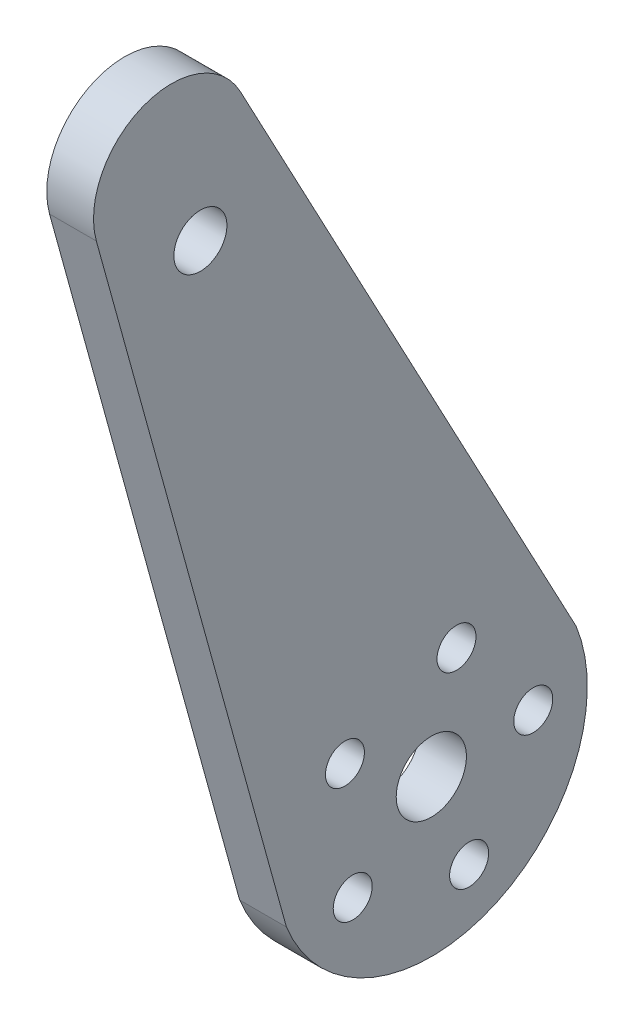
ISO-10303-21;
HEADER;
FILE_DESCRIPTION(('STEP AP214'),'2;1');
FILE_NAME('part.step','',(''),(''),'','','');
FILE_SCHEMA(('AUTOMOTIVE_DESIGN { 1 0 10303 214 1 1 1 1 }'));
ENDSEC;
DATA;
#1=APPLICATION_CONTEXT('core data for automotive mechanical design processes');
#2=APPLICATION_PROTOCOL_DEFINITION('international standard','automotive_design',2000,#1);
#3=PRODUCT_CONTEXT('',#1,'mechanical');
#4=PRODUCT('Part','Part','',(#3));
#5=PRODUCT_RELATED_PRODUCT_CATEGORY('part','',(#4));
#6=PRODUCT_DEFINITION_FORMATION('','',#4);
#7=PRODUCT_DEFINITION_CONTEXT('part definition',#1,'design');
#8=PRODUCT_DEFINITION('design','',#6,#7);
#9=PRODUCT_DEFINITION_SHAPE('','',#8);
#10=(LENGTH_UNIT() NAMED_UNIT(*) SI_UNIT(.MILLI.,.METRE.));
#11=(NAMED_UNIT(*) PLANE_ANGLE_UNIT() SI_UNIT($,.RADIAN.));
#12=(NAMED_UNIT(*) SI_UNIT($,.STERADIAN.) SOLID_ANGLE_UNIT());
#13=UNCERTAINTY_MEASURE_WITH_UNIT(LENGTH_MEASURE(1.E-05),#10,'distance_accuracy_value','');
#14=(GEOMETRIC_REPRESENTATION_CONTEXT(3) GLOBAL_UNCERTAINTY_ASSIGNED_CONTEXT((#13)) GLOBAL_UNIT_ASSIGNED_CONTEXT((#10,
#11,#12)) REPRESENTATION_CONTEXT('',''));
#15=CARTESIAN_POINT('',(0.,0.,0.));
#16=DIRECTION('',(0.,0.,1.));
#17=DIRECTION('',(1.,0.,0.));
#18=AXIS2_PLACEMENT_3D('',#15,#16,#17);
#19=CARTESIAN_POINT('',(-9.99999999999864,57.2046296254785,136.654517161316));
#20=DIRECTION('',(-1.,0.,0.));
#21=DIRECTION('',(0.,0.,1.));
#22=AXIS2_PLACEMENT_3D('',#19,#20,#21);
#23=PLANE('',#22);
#24=CARTESIAN_POINT('',(-10.,15.4,120.));
#25=DIRECTION('',(-1.,0.,0.));
#26=DIRECTION('',(0.,0.,1.));
#27=AXIS2_PLACEMENT_3D('',#24,#25,#26);
#28=CIRCLE('',#27,2.25);
#29=CARTESIAN_POINT('',(-10.,15.4,122.25));
#30=VERTEX_POINT('',#29);
#31=EDGE_CURVE('E143',#30,#30,#28,.T.);
#32=ORIENTED_EDGE('',*,*,#31,.F.);
#33=EDGE_LOOP('',(#32));
#34=FACE_BOUND('',#33,.T.);
#35=CARTESIAN_POINT('',(-10.,52.5596707782031,134.804015254503));
#36=DIRECTION('',(-1.,0.,0.));
#37=DIRECTION('',(0.,0.,1.));
#38=AXIS2_PLACEMENT_3D('',#35,#36,#37);
#39=CIRCLE('',#38,1.7);
#40=CARTESIAN_POINT('',(-10.,52.5596707782031,136.504015254503));
#41=VERTEX_POINT('',#40);
#42=EDGE_CURVE('E133',#41,#41,#39,.T.);
#43=ORIENTED_EDGE('',*,*,#42,.F.);
#44=EDGE_LOOP('',(#43));
#45=FACE_BOUND('',#44,.T.);
#46=CARTESIAN_POINT('',(-9.99999999999887,15.8251744841329,113.463814058792));
#47=DIRECTION('',(-1.,0.,0.));
#48=DIRECTION('',(0.,0.,1.));
#49=AXIS2_PLACEMENT_3D('',#46,#47,#48);
#50=CIRCLE('',#49,1.24999999999995);
#51=CARTESIAN_POINT('',(-9.99999999999886,15.8251744841329,114.713814058792));
#52=VERTEX_POINT('',#51);
#53=EDGE_CURVE('E159',#52,#52,#50,.T.);
#54=ORIENTED_EDGE('',*,*,#53,.F.);
#55=EDGE_LOOP('',(#54));
#56=FACE_BOUND('',#55,.T.);
#57=CARTESIAN_POINT('',(-9.99999999999875,11.2141529142785,125.037974213407));
#58=DIRECTION('',(-1.,0.,0.));
#59=DIRECTION('',(0.,0.,1.));
#60=AXIS2_PLACEMENT_3D('',#57,#58,#59);
#61=CIRCLE('',#60,1.25000000000004);
#62=CARTESIAN_POINT('',(-9.99999999999874,11.2141529142785,126.287974213407));
#63=VERTEX_POINT('',#62);
#64=EDGE_CURVE('E175',#63,#63,#61,.T.);
#65=ORIENTED_EDGE('',*,*,#64,.F.);
#66=EDGE_LOOP('',(#65));
#67=FACE_BOUND('',#66,.T.);
#68=CARTESIAN_POINT('',(-9.99999999999864,57.2046296254785,136.654517161316));
#69=DIRECTION('',(-1.,0.,0.));
#70=DIRECTION('',(0.,0.,1.));
#71=AXIS2_PLACEMENT_3D('',#68,#69,#70);
#72=CIRCLE('',#71,5.00000000000002);
#73=CARTESIAN_POINT('',(-9.99999999999859,55.8751790081828,141.474533868433));
#74=VERTEX_POINT('',#73);
#75=CARTESIAN_POINT('',(-9.99999999999868,59.5538184181805,132.240753232821));
#76=VERTEX_POINT('',#75);
#77=EDGE_CURVE('E80',#74,#76,#72,.T.);
#78=ORIENTED_EDGE('',*,*,#77,.T.);
#79=DIRECTION('',(0.,0.882752785708339,0.469837758512625));
#80=VECTOR('',#79,1.);
#81=CARTESIAN_POINT('',(-10.0000000020829,-392844.673959146,-208987.7356182));
#82=LINE('',#81,#80);
#83=CARTESIAN_POINT('',(-9.9999999999989,19.1010038137222,110.710082305488));
#84=VERTEX_POINT('',#83);
#85=EDGE_CURVE('E88',#84,#76,#82,.T.);
#86=ORIENTED_EDGE('',*,*,#85,.F.);
#87=CARTESIAN_POINT('',(-9.9999999999988,15.4,120.));
#88=DIRECTION('',(-1.,0.,0.));
#89=DIRECTION('',(0.,0.,1.));
#90=AXIS2_PLACEMENT_3D('',#87,#88,#89);
#91=CIRCLE('',#90,9.99999999999999);
#92=CARTESIAN_POINT('',(-9.99999999999871,11.6989961864533,129.289917694649));
#93=VERTEX_POINT('',#92);
#94=EDGE_CURVE('E94',#84,#93,#91,.T.);
#95=ORIENTED_EDGE('',*,*,#94,.T.);
#96=DIRECTION('',(0.,-0.964003341403419,-0.265890123477808));
#97=VECTOR('',#96,1.);
#98=CARTESIAN_POINT('',(-10.0000000010246,-373154.184489817,-102796.82929404));
#99=LINE('',#98,#97);
#100=EDGE_CURVE('E97',#74,#93,#99,.T.);
#101=ORIENTED_EDGE('',*,*,#100,.F.);
#102=EDGE_LOOP('',(#78,#86,#95,#101));
#103=FACE_BOUND('',#102,.T.);
#104=CARTESIAN_POINT('',(-9.99999999999883,9.31510391006918,117.575842502075));
#105=DIRECTION('',(-1.,0.,0.));
#106=DIRECTION('',(0.,0.,1.));
#107=AXIS2_PLACEMENT_3D('',#104,#105,#106);
#108=CIRCLE('',#107,1.24999999999995);
#109=CARTESIAN_POINT('',(-9.99999999999882,9.31510391006918,118.825842502075));
#110=VERTEX_POINT('',#109);
#111=EDGE_CURVE('E113',#110,#110,#108,.T.);
#112=ORIENTED_EDGE('',*,*,#111,.F.);
#113=EDGE_LOOP('',(#112));
#114=FACE_BOUND('',#113,.T.);
#115=CARTESIAN_POINT('',(-9.99999999999875,18.8979003192452,125.537796796256));
#116=DIRECTION('',(-1.,0.,0.));
#117=DIRECTION('',(0.,0.,1.));
#118=AXIS2_PLACEMENT_3D('',#115,#116,#117);
#119=CIRCLE('',#118,1.24999999999992);
#120=CARTESIAN_POINT('',(-9.99999999999874,18.8979003192452,126.787796796256));
#121=VERTEX_POINT('',#120);
#122=EDGE_CURVE('E167',#121,#121,#119,.T.);
#123=ORIENTED_EDGE('',*,*,#122,.F.);
#124=EDGE_LOOP('',(#123));
#125=FACE_BOUND('',#124,.T.);
#126=CARTESIAN_POINT('',(-9.99999999999882,21.7476683722741,118.384572429469));
#127=DIRECTION('',(-1.,0.,0.));
#128=DIRECTION('',(0.,0.,1.));
#129=AXIS2_PLACEMENT_3D('',#126,#127,#128);
#130=CIRCLE('',#129,1.24999999999994);
#131=CARTESIAN_POINT('',(-9.99999999999881,21.7476683722741,119.634572429469));
#132=VERTEX_POINT('',#131);
#133=EDGE_CURVE('E151',#132,#132,#130,.T.);
#134=ORIENTED_EDGE('',*,*,#133,.F.);
#135=EDGE_LOOP('',(#134));
#136=FACE_BOUND('',#135,.T.);
#137=ADVANCED_FACE('F37',(#34,#45,#56,#67,#103,#114,#125,#136),#23,.T.);
#138=CARTESIAN_POINT('',(-6.99999999999864,57.2046296254785,136.654517161316));
#139=DIRECTION('',(-1.,0.,0.));
#140=DIRECTION('',(0.,0.,1.));
#141=AXIS2_PLACEMENT_3D('',#138,#139,#140);
#142=PLANE('',#141);
#143=CARTESIAN_POINT('',(-6.9999999999986,15.4,120.));
#144=DIRECTION('',(-1.,0.,0.));
#145=DIRECTION('',(0.,0.,1.));
#146=AXIS2_PLACEMENT_3D('',#143,#144,#145);
#147=CIRCLE('',#146,2.25);
#148=CARTESIAN_POINT('',(-6.9999999999986,15.4,122.25));
#149=VERTEX_POINT('',#148);
#150=EDGE_CURVE('E138',#149,#149,#147,.T.);
#151=ORIENTED_EDGE('',*,*,#150,.T.);
#152=EDGE_LOOP('',(#151));
#153=FACE_BOUND('',#152,.T.);
#154=CARTESIAN_POINT('',(-6.9999999999986,52.5596707782031,134.804015254503));
#155=DIRECTION('',(-1.,0.,0.));
#156=DIRECTION('',(0.,0.,1.));
#157=AXIS2_PLACEMENT_3D('',#154,#155,#156);
#158=CIRCLE('',#157,1.7);
#159=CARTESIAN_POINT('',(-6.9999999999986,52.5596707782031,136.504015254503));
#160=VERTEX_POINT('',#159);
#161=EDGE_CURVE('E128',#160,#160,#158,.T.);
#162=ORIENTED_EDGE('',*,*,#161,.T.);
#163=EDGE_LOOP('',(#162));
#164=FACE_BOUND('',#163,.T.);
#165=CARTESIAN_POINT('',(-6.99999999999864,57.2046296254785,136.654517161316));
#166=DIRECTION('',(-1.,0.,0.));
#167=DIRECTION('',(0.,0.,1.));
#168=AXIS2_PLACEMENT_3D('',#165,#166,#167);
#169=CIRCLE('',#168,5.00000000000002);
#170=CARTESIAN_POINT('',(-6.99999999999859,55.8751790081828,141.474533868433));
#171=VERTEX_POINT('',#170);
#172=CARTESIAN_POINT('',(-6.99999999999868,59.5538184181805,132.240753232821));
#173=VERTEX_POINT('',#172);
#174=EDGE_CURVE('E110',#171,#173,#169,.T.);
#175=ORIENTED_EDGE('',*,*,#174,.F.);
#176=DIRECTION('',(0.,-0.964003341403419,-0.265890123477808));
#177=VECTOR('',#176,1.);
#178=CARTESIAN_POINT('',(-7.00000000102455,-373154.184489817,-102796.82929404));
#179=LINE('',#178,#177);
#180=CARTESIAN_POINT('',(-6.99999999999871,11.6989961864533,129.289917694649));
#181=VERTEX_POINT('',#180);
#182=EDGE_CURVE('E104',#171,#181,#179,.T.);
#183=ORIENTED_EDGE('',*,*,#182,.T.);
#184=CARTESIAN_POINT('',(-6.9999999999988,15.4,120.));
#185=DIRECTION('',(-1.,0.,0.));
#186=DIRECTION('',(0.,0.,1.));
#187=AXIS2_PLACEMENT_3D('',#184,#185,#186);
#188=CIRCLE('',#187,9.99999999999999);
#189=CARTESIAN_POINT('',(-6.9999999999989,19.1010038137222,110.710082305488));
#190=VERTEX_POINT('',#189);
#191=EDGE_CURVE('E116',#190,#181,#188,.T.);
#192=ORIENTED_EDGE('',*,*,#191,.F.);
#193=DIRECTION('',(0.,0.882752785708339,0.469837758512625));
#194=VECTOR('',#193,1.);
#195=CARTESIAN_POINT('',(-7.00000000208293,-392844.673959146,-208987.7356182));
#196=LINE('',#195,#194);
#197=EDGE_CURVE('E90',#190,#173,#196,.T.);
#198=ORIENTED_EDGE('',*,*,#197,.T.);
#199=EDGE_LOOP('',(#175,#183,#192,#198));
#200=FACE_BOUND('',#199,.T.);
#201=CARTESIAN_POINT('',(-6.99999999999883,9.31510391006918,117.575842502075));
#202=DIRECTION('',(-1.,0.,0.));
#203=DIRECTION('',(0.,0.,1.));
#204=AXIS2_PLACEMENT_3D('',#201,#202,#203);
#205=CIRCLE('',#204,1.24999999999995);
#206=CARTESIAN_POINT('',(-6.99999999999882,9.31510391006918,118.825842502075));
#207=VERTEX_POINT('',#206);
#208=EDGE_CURVE('E179',#207,#207,#205,.T.);
#209=ORIENTED_EDGE('',*,*,#208,.T.);
#210=EDGE_LOOP('',(#209));
#211=FACE_BOUND('',#210,.T.);
#212=CARTESIAN_POINT('',(-6.99999999999875,11.2141529142785,125.037974213407));
#213=DIRECTION('',(-1.,0.,0.));
#214=DIRECTION('',(0.,0.,1.));
#215=AXIS2_PLACEMENT_3D('',#212,#213,#214);
#216=CIRCLE('',#215,1.25000000000004);
#217=CARTESIAN_POINT('',(-6.99999999999874,11.2141529142785,126.287974213407));
#218=VERTEX_POINT('',#217);
#219=EDGE_CURVE('E171',#218,#218,#216,.T.);
#220=ORIENTED_EDGE('',*,*,#219,.T.);
#221=EDGE_LOOP('',(#220));
#222=FACE_BOUND('',#221,.T.);
#223=CARTESIAN_POINT('',(-6.99999999999875,18.8979003192452,125.537796796256));
#224=DIRECTION('',(-1.,0.,0.));
#225=DIRECTION('',(0.,0.,1.));
#226=AXIS2_PLACEMENT_3D('',#223,#224,#225);
#227=CIRCLE('',#226,1.24999999999992);
#228=CARTESIAN_POINT('',(-6.99999999999874,18.8979003192452,126.787796796256));
#229=VERTEX_POINT('',#228);
#230=EDGE_CURVE('E163',#229,#229,#227,.T.);
#231=ORIENTED_EDGE('',*,*,#230,.T.);
#232=EDGE_LOOP('',(#231));
#233=FACE_BOUND('',#232,.T.);
#234=CARTESIAN_POINT('',(-6.99999999999887,15.8251744841329,113.463814058792));
#235=DIRECTION('',(-1.,0.,0.));
#236=DIRECTION('',(0.,0.,1.));
#237=AXIS2_PLACEMENT_3D('',#234,#235,#236);
#238=CIRCLE('',#237,1.24999999999995);
#239=CARTESIAN_POINT('',(-6.99999999999886,15.8251744841329,114.713814058792));
#240=VERTEX_POINT('',#239);
#241=EDGE_CURVE('E155',#240,#240,#238,.T.);
#242=ORIENTED_EDGE('',*,*,#241,.T.);
#243=EDGE_LOOP('',(#242));
#244=FACE_BOUND('',#243,.T.);
#245=CARTESIAN_POINT('',(-6.99999999999882,21.7476683722741,118.384572429469));
#246=DIRECTION('',(-1.,0.,0.));
#247=DIRECTION('',(0.,0.,1.));
#248=AXIS2_PLACEMENT_3D('',#245,#246,#247);
#249=CIRCLE('',#248,1.24999999999994);
#250=CARTESIAN_POINT('',(-6.99999999999881,21.7476683722741,119.634572429469));
#251=VERTEX_POINT('',#250);
#252=EDGE_CURVE('E132',#251,#251,#249,.T.);
#253=ORIENTED_EDGE('',*,*,#252,.T.);
#254=EDGE_LOOP('',(#253));
#255=FACE_BOUND('',#254,.T.);
#256=ADVANCED_FACE('F190',(#153,#164,#200,#211,#222,#233,#244,#255),#142,.F.);
#257=CARTESIAN_POINT('',(-9.99999999999864,57.2046296254785,136.654517161316));
#258=DIRECTION('',(1.,0.,0.));
#259=DIRECTION('',(0.,0.,-1.));
#260=AXIS2_PLACEMENT_3D('',#257,#258,#259);
#261=CYLINDRICAL_SURFACE('',#260,5.00000000000002);
#262=ORIENTED_EDGE('',*,*,#174,.T.);
#263=DIRECTION('',(1.,0.,0.));
#264=VECTOR('',#263,1.);
#265=CARTESIAN_POINT('',(-9.99999999999868,59.5538184181805,132.240753232821));
#266=LINE('',#265,#264);
#267=EDGE_CURVE('E11',#76,#173,#266,.T.);
#268=ORIENTED_EDGE('',*,*,#267,.F.);
#269=ORIENTED_EDGE('',*,*,#77,.F.);
#270=DIRECTION('',(1.,0.,0.));
#271=VECTOR('',#270,1.);
#272=CARTESIAN_POINT('',(-9.99999999999859,55.8751790081828,141.474533868433));
#273=LINE('',#272,#271);
#274=EDGE_CURVE('E55',#74,#171,#273,.T.);
#275=ORIENTED_EDGE('',*,*,#274,.T.);
#276=EDGE_LOOP('',(#262,#268,#269,#275));
#277=FACE_BOUND('',#276,.T.);
#278=ADVANCED_FACE('F39',(#277),#261,.T.);
#279=CARTESIAN_POINT('',(-10.0000000020829,-392844.673959146,-208987.7356182));
#280=DIRECTION('',(0.,0.469837758512624,-0.882752785708339));
#281=DIRECTION('',(0.,0.882752785708339,0.469837758512624));
#282=AXIS2_PLACEMENT_3D('',#279,#280,#281);
#283=PLANE('',#282);
#284=ORIENTED_EDGE('',*,*,#197,.F.);
#285=DIRECTION('',(1.,0.,0.));
#286=VECTOR('',#285,1.);
#287=CARTESIAN_POINT('',(-9.9999999999989,19.1010038137222,110.710082305488));
#288=LINE('',#287,#286);
#289=EDGE_CURVE('E47',#84,#190,#288,.T.);
#290=ORIENTED_EDGE('',*,*,#289,.F.);
#291=ORIENTED_EDGE('',*,*,#85,.T.);
#292=ORIENTED_EDGE('',*,*,#267,.T.);
#293=EDGE_LOOP('',(#284,#290,#291,#292));
#294=FACE_BOUND('',#293,.T.);
#295=ADVANCED_FACE('F87',(#294),#283,.T.);
#296=CARTESIAN_POINT('',(-9.9999999999988,15.4,120.));
#297=DIRECTION('',(1.,0.,0.));
#298=DIRECTION('',(0.,0.,-1.));
#299=AXIS2_PLACEMENT_3D('',#296,#297,#298);
#300=CYLINDRICAL_SURFACE('',#299,9.99999999999999);
#301=ORIENTED_EDGE('',*,*,#191,.T.);
#302=DIRECTION('',(1.,0.,0.));
#303=VECTOR('',#302,1.);
#304=CARTESIAN_POINT('',(-9.99999999999871,11.6989961864533,129.289917694649));
#305=LINE('',#304,#303);
#306=EDGE_CURVE('E69',#93,#181,#305,.T.);
#307=ORIENTED_EDGE('',*,*,#306,.F.);
#308=ORIENTED_EDGE('',*,*,#94,.F.);
#309=ORIENTED_EDGE('',*,*,#289,.T.);
#310=EDGE_LOOP('',(#301,#307,#308,#309));
#311=FACE_BOUND('',#310,.T.);
#312=ADVANCED_FACE('F95',(#311),#300,.T.);
#313=CARTESIAN_POINT('',(-10.0000000010246,-373154.184489817,-102796.82929404));
#314=DIRECTION('',(0.,-0.265890123477808,0.964003341403418));
#315=DIRECTION('',(0.,-0.964003341403419,-0.265890123477808));
#316=AXIS2_PLACEMENT_3D('',#313,#314,#315);
#317=PLANE('',#316);
#318=ORIENTED_EDGE('',*,*,#182,.F.);
#319=ORIENTED_EDGE('',*,*,#274,.F.);
#320=ORIENTED_EDGE('',*,*,#100,.T.);
#321=ORIENTED_EDGE('',*,*,#306,.T.);
#322=EDGE_LOOP('',(#318,#319,#320,#321));
#323=FACE_BOUND('',#322,.T.);
#324=ADVANCED_FACE('F196',(#323),#317,.T.);
#325=CARTESIAN_POINT('',(-9.99999999999883,9.31510391006918,117.575842502075));
#326=DIRECTION('',(1.,0.,0.));
#327=DIRECTION('',(0.,0.,-1.));
#328=AXIS2_PLACEMENT_3D('',#325,#326,#327);
#329=CYLINDRICAL_SURFACE('',#328,1.24999999999995);
#330=ORIENTED_EDGE('',*,*,#111,.T.);
#331=EDGE_LOOP('',(#330));
#332=FACE_BOUND('',#331,.T.);
#333=ORIENTED_EDGE('',*,*,#208,.F.);
#334=EDGE_LOOP('',(#333));
#335=FACE_BOUND('',#334,.T.);
#336=ADVANCED_FACE('F193',(#332,#335),#329,.F.);
#337=CARTESIAN_POINT('',(-9.99999999999875,11.2141529142785,125.037974213407));
#338=DIRECTION('',(1.,0.,0.));
#339=DIRECTION('',(0.,0.,-1.));
#340=AXIS2_PLACEMENT_3D('',#337,#338,#339);
#341=CYLINDRICAL_SURFACE('',#340,1.25000000000004);
#342=ORIENTED_EDGE('',*,*,#64,.T.);
#343=EDGE_LOOP('',(#342));
#344=FACE_BOUND('',#343,.T.);
#345=ORIENTED_EDGE('',*,*,#219,.F.);
#346=EDGE_LOOP('',(#345));
#347=FACE_BOUND('',#346,.T.);
#348=ADVANCED_FACE('F195',(#344,#347),#341,.F.);
#349=CARTESIAN_POINT('',(-9.99999999999875,18.8979003192452,125.537796796256));
#350=DIRECTION('',(1.,0.,0.));
#351=DIRECTION('',(0.,0.,-1.));
#352=AXIS2_PLACEMENT_3D('',#349,#350,#351);
#353=CYLINDRICAL_SURFACE('',#352,1.24999999999992);
#354=ORIENTED_EDGE('',*,*,#122,.T.);
#355=EDGE_LOOP('',(#354));
#356=FACE_BOUND('',#355,.T.);
#357=ORIENTED_EDGE('',*,*,#230,.F.);
#358=EDGE_LOOP('',(#357));
#359=FACE_BOUND('',#358,.T.);
#360=ADVANCED_FACE('F203',(#356,#359),#353,.F.);
#361=CARTESIAN_POINT('',(-9.99999999999887,15.8251744841329,113.463814058792));
#362=DIRECTION('',(1.,0.,0.));
#363=DIRECTION('',(0.,0.,-1.));
#364=AXIS2_PLACEMENT_3D('',#361,#362,#363);
#365=CYLINDRICAL_SURFACE('',#364,1.24999999999995);
#366=ORIENTED_EDGE('',*,*,#53,.T.);
#367=EDGE_LOOP('',(#366));
#368=FACE_BOUND('',#367,.T.);
#369=ORIENTED_EDGE('',*,*,#241,.F.);
#370=EDGE_LOOP('',(#369));
#371=FACE_BOUND('',#370,.T.);
#372=ADVANCED_FACE('F260',(#368,#371),#365,.F.);
#373=CARTESIAN_POINT('',(-9.99999999999882,21.7476683722741,118.384572429469));
#374=DIRECTION('',(1.,0.,0.));
#375=DIRECTION('',(0.,0.,-1.));
#376=AXIS2_PLACEMENT_3D('',#373,#374,#375);
#377=CYLINDRICAL_SURFACE('',#376,1.24999999999994);
#378=ORIENTED_EDGE('',*,*,#133,.T.);
#379=EDGE_LOOP('',(#378));
#380=FACE_BOUND('',#379,.T.);
#381=ORIENTED_EDGE('',*,*,#252,.F.);
#382=EDGE_LOOP('',(#381));
#383=FACE_BOUND('',#382,.T.);
#384=ADVANCED_FACE('F253',(#380,#383),#377,.F.);
#385=CARTESIAN_POINT('',(-10.,52.5596707782031,134.804015254503));
#386=DIRECTION('',(-1.,0.,0.));
#387=DIRECTION('',(0.,0.,1.));
#388=AXIS2_PLACEMENT_3D('',#385,#386,#387);
#389=CYLINDRICAL_SURFACE('',#388,1.7);
#390=ORIENTED_EDGE('',*,*,#161,.F.);
#391=EDGE_LOOP('',(#390));
#392=FACE_BOUND('',#391,.T.);
#393=ORIENTED_EDGE('',*,*,#42,.T.);
#394=EDGE_LOOP('',(#393));
#395=FACE_BOUND('',#394,.T.);
#396=ADVANCED_FACE('F242',(#392,#395),#389,.F.);
#397=CARTESIAN_POINT('',(-10.,15.4,120.));
#398=DIRECTION('',(-1.,0.,0.));
#399=DIRECTION('',(0.,0.,1.));
#400=AXIS2_PLACEMENT_3D('',#397,#398,#399);
#401=CYLINDRICAL_SURFACE('',#400,2.25);
#402=ORIENTED_EDGE('',*,*,#150,.F.);
#403=EDGE_LOOP('',(#402));
#404=FACE_BOUND('',#403,.T.);
#405=ORIENTED_EDGE('',*,*,#31,.T.);
#406=EDGE_LOOP('',(#405));
#407=FACE_BOUND('',#406,.T.);
#408=ADVANCED_FACE('F238',(#404,#407),#401,.F.);
#409=CLOSED_SHELL('',(#137,#256,#278,#295,#312,#324,#336,#348,#360,#372,#384,#396,#408));
#410=MANIFOLD_SOLID_BREP('B2',#409);
#411=ADVANCED_BREP_SHAPE_REPRESENTATION('',(#18,#410),#14);
#412=SHAPE_DEFINITION_REPRESENTATION(#9,#411);
ENDSEC;
END-ISO-10303-21;
